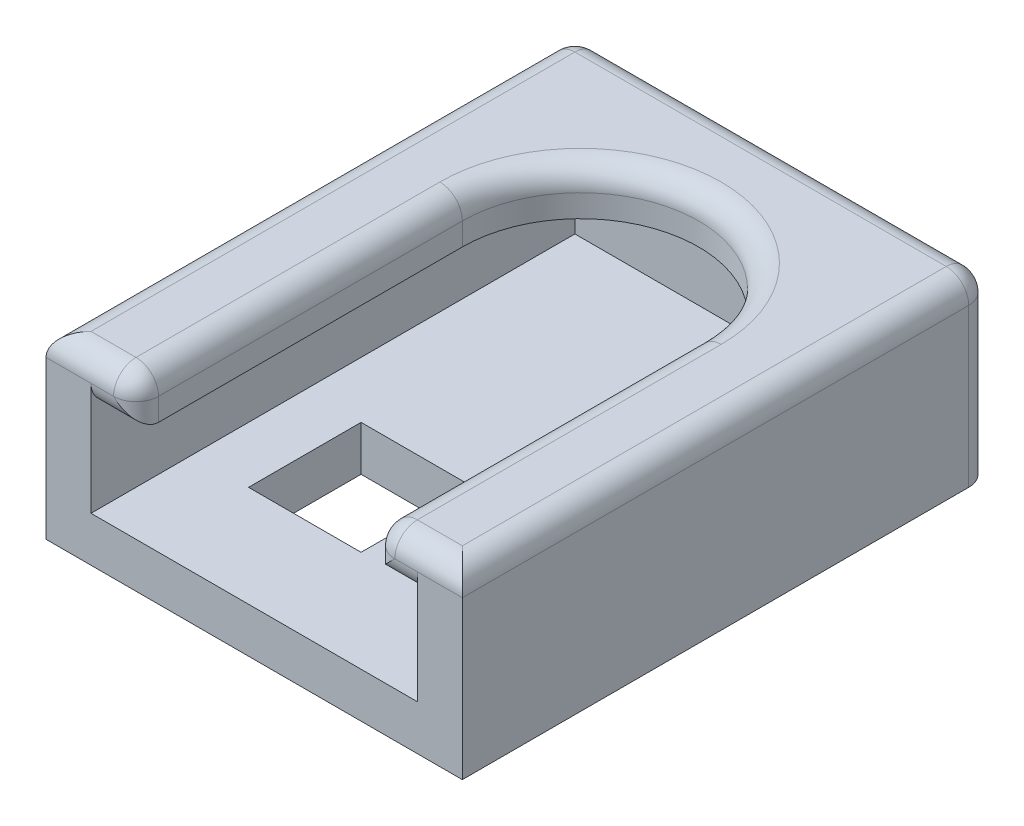
ISO-10303-21;
HEADER;
FILE_DESCRIPTION(('STEP AP214'),'2;1');
FILE_NAME('part.step','',(''),(''),'','','');
FILE_SCHEMA(('AUTOMOTIVE_DESIGN { 1 0 10303 214 1 1 1 1 }'));
ENDSEC;
DATA;
#1=APPLICATION_CONTEXT('core data for automotive mechanical design processes');
#2=APPLICATION_PROTOCOL_DEFINITION('international standard','automotive_design',2000,#1);
#3=PRODUCT_CONTEXT('',#1,'mechanical');
#4=PRODUCT('Part','Part','',(#3));
#5=PRODUCT_RELATED_PRODUCT_CATEGORY('part','',(#4));
#6=PRODUCT_DEFINITION_FORMATION('','',#4);
#7=PRODUCT_DEFINITION_CONTEXT('part definition',#1,'design');
#8=PRODUCT_DEFINITION('design','',#6,#7);
#9=PRODUCT_DEFINITION_SHAPE('','',#8);
#10=(LENGTH_UNIT() NAMED_UNIT(*) SI_UNIT(.MILLI.,.METRE.));
#11=(NAMED_UNIT(*) PLANE_ANGLE_UNIT() SI_UNIT($,.RADIAN.));
#12=(NAMED_UNIT(*) SI_UNIT($,.STERADIAN.) SOLID_ANGLE_UNIT());
#13=UNCERTAINTY_MEASURE_WITH_UNIT(LENGTH_MEASURE(1.E-05),#10,'distance_accuracy_value','');
#14=(GEOMETRIC_REPRESENTATION_CONTEXT(3) GLOBAL_UNCERTAINTY_ASSIGNED_CONTEXT((#13)) GLOBAL_UNIT_ASSIGNED_CONTEXT((#10,
#11,#12)) REPRESENTATION_CONTEXT('',''));
#15=CARTESIAN_POINT('',(0.,0.,0.));
#16=DIRECTION('',(0.,0.,1.));
#17=DIRECTION('',(1.,0.,0.));
#18=AXIS2_PLACEMENT_3D('',#15,#16,#17);
#19=CARTESIAN_POINT('',(7.25,6.,-10.75));
#20=DIRECTION('',(-1.,0.,0.));
#21=DIRECTION('',(0.,0.,1.));
#22=AXIS2_PLACEMENT_3D('',#19,#20,#21);
#23=PLANE('',#22);
#24=DIRECTION('',(0.,-1.,0.));
#25=VECTOR('',#24,1.);
#26=CARTESIAN_POINT('',(7.25,6.,10.75));
#27=LINE('',#26,#25);
#28=CARTESIAN_POINT('',(7.25,5.,10.75));
#29=VERTEX_POINT('',#28);
#30=CARTESIAN_POINT('',(7.25,0.,10.75));
#31=VERTEX_POINT('',#30);
#32=EDGE_CURVE('E333',#29,#31,#27,.T.);
#33=ORIENTED_EDGE('',*,*,#32,.F.);
#34=CARTESIAN_POINT('',(7.25,5.,9.75));
#35=DIRECTION('',(-1.,0.,0.));
#36=DIRECTION('',(0.,0.,1.));
#37=AXIS2_PLACEMENT_3D('',#34,#35,#36);
#38=CIRCLE('',#37,1.);
#39=CARTESIAN_POINT('',(7.25,4.,9.75));
#40=VERTEX_POINT('',#39);
#41=EDGE_CURVE('E11',#29,#40,#38,.F.);
#42=ORIENTED_EDGE('',*,*,#41,.T.);
#43=DIRECTION('',(0.,0.,1.));
#44=VECTOR('',#43,1.);
#45=CARTESIAN_POINT('',(7.25,4.,0.));
#46=LINE('',#45,#44);
#47=CARTESIAN_POINT('',(7.25,4.,-10.75));
#48=VERTEX_POINT('',#47);
#49=EDGE_CURVE('E304',#48,#40,#46,.T.);
#50=ORIENTED_EDGE('',*,*,#49,.F.);
#51=DIRECTION('',(0.,-1.,0.));
#52=VECTOR('',#51,1.);
#53=CARTESIAN_POINT('',(7.25,6.,-10.75));
#54=LINE('',#53,#52);
#55=CARTESIAN_POINT('',(7.25,0.,-10.75));
#56=VERTEX_POINT('',#55);
#57=EDGE_CURVE('E339',#48,#56,#54,.T.);
#58=ORIENTED_EDGE('',*,*,#57,.T.);
#59=DIRECTION('',(0.,0.,-1.));
#60=VECTOR('',#59,1.);
#61=CARTESIAN_POINT('',(7.25,0.,-10.75));
#62=LINE('',#61,#60);
#63=EDGE_CURVE('E319',#31,#56,#62,.T.);
#64=ORIENTED_EDGE('',*,*,#63,.F.);
#65=EDGE_LOOP('',(#33,#42,#50,#58,#64));
#66=FACE_BOUND('',#65,.T.);
#67=ADVANCED_FACE('F39',(#66),#23,.T.);
#68=CARTESIAN_POINT('',(-7.25,6.,-10.75));
#69=DIRECTION('',(0.,0.,1.));
#70=DIRECTION('',(1.,0.,0.));
#71=AXIS2_PLACEMENT_3D('',#68,#69,#70);
#72=PLANE('',#71);
#73=ORIENTED_EDGE('',*,*,#57,.F.);
#74=DIRECTION('',(1.,0.,0.));
#75=VECTOR('',#74,1.);
#76=CARTESIAN_POINT('',(0.,4.,-10.75));
#77=LINE('',#76,#75);
#78=CARTESIAN_POINT('',(-7.25,4.,-10.75));
#79=VERTEX_POINT('',#78);
#80=EDGE_CURVE('E307',#79,#48,#77,.T.);
#81=ORIENTED_EDGE('',*,*,#80,.F.);
#82=DIRECTION('',(0.,-1.,0.));
#83=VECTOR('',#82,1.);
#84=CARTESIAN_POINT('',(-7.25,6.,-10.75));
#85=LINE('',#84,#83);
#86=CARTESIAN_POINT('',(-7.25,0.,-10.75));
#87=VERTEX_POINT('',#86);
#88=EDGE_CURVE('E337',#79,#87,#85,.T.);
#89=ORIENTED_EDGE('',*,*,#88,.T.);
#90=DIRECTION('',(-1.,0.,0.));
#91=VECTOR('',#90,1.);
#92=CARTESIAN_POINT('',(-7.25,0.,-10.75));
#93=LINE('',#92,#91);
#94=EDGE_CURVE('E324',#56,#87,#93,.T.);
#95=ORIENTED_EDGE('',*,*,#94,.F.);
#96=EDGE_LOOP('',(#73,#81,#89,#95));
#97=FACE_BOUND('',#96,.T.);
#98=ADVANCED_FACE('F458',(#97),#72,.T.);
#99=CARTESIAN_POINT('',(-7.25,6.,-10.75));
#100=DIRECTION('',(1.,0.,0.));
#101=DIRECTION('',(0.,0.,-1.));
#102=AXIS2_PLACEMENT_3D('',#99,#100,#101);
#103=PLANE('',#102);
#104=ORIENTED_EDGE('',*,*,#88,.F.);
#105=DIRECTION('',(0.,0.,-1.));
#106=VECTOR('',#105,1.);
#107=CARTESIAN_POINT('',(-7.25,4.,0.));
#108=LINE('',#107,#106);
#109=CARTESIAN_POINT('',(-7.25,4.,9.75));
#110=VERTEX_POINT('',#109);
#111=EDGE_CURVE('E310',#110,#79,#108,.T.);
#112=ORIENTED_EDGE('',*,*,#111,.F.);
#113=CARTESIAN_POINT('',(-7.25,5.,9.75));
#114=DIRECTION('',(1.,0.,0.));
#115=DIRECTION('',(0.,0.,-1.));
#116=AXIS2_PLACEMENT_3D('',#113,#114,#115);
#117=CIRCLE('',#116,1.);
#118=CARTESIAN_POINT('',(-7.25,5.,10.75));
#119=VERTEX_POINT('',#118);
#120=EDGE_CURVE('E49',#110,#119,#117,.F.);
#121=ORIENTED_EDGE('',*,*,#120,.T.);
#122=DIRECTION('',(0.,-1.,0.));
#123=VECTOR('',#122,1.);
#124=CARTESIAN_POINT('',(-7.25,6.,10.75));
#125=LINE('',#124,#123);
#126=CARTESIAN_POINT('',(-7.25,0.,10.75));
#127=VERTEX_POINT('',#126);
#128=EDGE_CURVE('E335',#119,#127,#125,.T.);
#129=ORIENTED_EDGE('',*,*,#128,.T.);
#130=DIRECTION('',(0.,0.,1.));
#131=VECTOR('',#130,1.);
#132=CARTESIAN_POINT('',(-7.25,0.,-10.75));
#133=LINE('',#132,#131);
#134=EDGE_CURVE('E327',#87,#127,#133,.T.);
#135=ORIENTED_EDGE('',*,*,#134,.F.);
#136=EDGE_LOOP('',(#104,#112,#121,#129,#135));
#137=FACE_BOUND('',#136,.T.);
#138=ADVANCED_FACE('F453',(#137),#103,.T.);
#139=CARTESIAN_POINT('',(9.25,6.,-10.75));
#140=DIRECTION('',(-1.,0.,0.));
#141=DIRECTION('',(0.,0.,1.));
#142=AXIS2_PLACEMENT_3D('',#139,#140,#141);
#143=PLANE('',#142);
#144=DIRECTION('',(0.,-1.,0.));
#145=VECTOR('',#144,1.);
#146=CARTESIAN_POINT('',(9.25,6.,-11.75));
#147=LINE('',#146,#145);
#148=CARTESIAN_POINT('',(9.25,-2.,-11.75));
#149=VERTEX_POINT('',#148);
#150=CARTESIAN_POINT('',(9.25,5.,-11.75));
#151=VERTEX_POINT('',#150);
#152=EDGE_CURVE('E392',#149,#151,#147,.F.);
#153=ORIENTED_EDGE('',*,*,#152,.T.);
#154=DIRECTION('',(0.,0.,-1.));
#155=VECTOR('',#154,1.);
#156=CARTESIAN_POINT('',(9.25,5.,10.75));
#157=LINE('',#156,#155);
#158=CARTESIAN_POINT('',(9.25,5.,10.75));
#159=VERTEX_POINT('',#158);
#160=EDGE_CURVE('E394',#151,#159,#157,.F.);
#161=ORIENTED_EDGE('',*,*,#160,.T.);
#162=DIRECTION('',(0.,-1.,0.));
#163=VECTOR('',#162,1.);
#164=CARTESIAN_POINT('',(9.25,6.,10.75));
#165=LINE('',#164,#163);
#166=CARTESIAN_POINT('',(9.25,-2.,10.75));
#167=VERTEX_POINT('',#166);
#168=EDGE_CURVE('E353',#159,#167,#165,.T.);
#169=ORIENTED_EDGE('',*,*,#168,.T.);
#170=DIRECTION('',(0.,0.,-1.));
#171=VECTOR('',#170,1.);
#172=CARTESIAN_POINT('',(9.25,-2.,-10.75));
#173=LINE('',#172,#171);
#174=EDGE_CURVE('E341',#167,#149,#173,.T.);
#175=ORIENTED_EDGE('',*,*,#174,.T.);
#176=EDGE_LOOP('',(#153,#161,#169,#175));
#177=FACE_BOUND('',#176,.T.);
#178=ADVANCED_FACE('F512',(#177),#143,.F.);
#179=CARTESIAN_POINT('',(-7.25,6.,-12.75));
#180=DIRECTION('',(0.,0.,1.));
#181=DIRECTION('',(1.,0.,0.));
#182=AXIS2_PLACEMENT_3D('',#179,#180,#181);
#183=PLANE('',#182);
#184=DIRECTION('',(-1.,0.,0.));
#185=VECTOR('',#184,1.);
#186=CARTESIAN_POINT('',(9.25,5.,-12.75));
#187=LINE('',#186,#185);
#188=CARTESIAN_POINT('',(-8.25,5.,-12.75));
#189=VERTEX_POINT('',#188);
#190=CARTESIAN_POINT('',(8.25,5.,-12.75));
#191=VERTEX_POINT('',#190);
#192=EDGE_CURVE('E214',#189,#191,#187,.F.);
#193=ORIENTED_EDGE('',*,*,#192,.T.);
#194=DIRECTION('',(0.,-1.,0.));
#195=VECTOR('',#194,1.);
#196=CARTESIAN_POINT('',(8.25,6.,-12.75));
#197=LINE('',#196,#195);
#198=CARTESIAN_POINT('',(8.25,-2.,-12.75));
#199=VERTEX_POINT('',#198);
#200=EDGE_CURVE('E218',#191,#199,#197,.T.);
#201=ORIENTED_EDGE('',*,*,#200,.T.);
#202=DIRECTION('',(-1.,0.,0.));
#203=VECTOR('',#202,1.);
#204=CARTESIAN_POINT('',(-7.25,-2.,-12.75));
#205=LINE('',#204,#203);
#206=CARTESIAN_POINT('',(-8.25,-2.,-12.75));
#207=VERTEX_POINT('',#206);
#208=EDGE_CURVE('E344',#199,#207,#205,.T.);
#209=ORIENTED_EDGE('',*,*,#208,.T.);
#210=DIRECTION('',(0.,-1.,0.));
#211=VECTOR('',#210,1.);
#212=CARTESIAN_POINT('',(-8.25,6.,-12.75));
#213=LINE('',#212,#211);
#214=EDGE_CURVE('E221',#207,#189,#213,.F.);
#215=ORIENTED_EDGE('',*,*,#214,.T.);
#216=EDGE_LOOP('',(#193,#201,#209,#215));
#217=FACE_BOUND('',#216,.T.);
#218=ADVANCED_FACE('F216',(#217),#183,.F.);
#219=CARTESIAN_POINT('',(-9.25,6.,-10.75));
#220=DIRECTION('',(1.,0.,0.));
#221=DIRECTION('',(0.,0.,-1.));
#222=AXIS2_PLACEMENT_3D('',#219,#220,#221);
#223=PLANE('',#222);
#224=DIRECTION('',(0.,-1.,0.));
#225=VECTOR('',#224,1.);
#226=CARTESIAN_POINT('',(-9.25,6.,10.75));
#227=LINE('',#226,#225);
#228=CARTESIAN_POINT('',(-9.25,5.,10.75));
#229=VERTEX_POINT('',#228);
#230=CARTESIAN_POINT('',(-9.25,-2.,10.75));
#231=VERTEX_POINT('',#230);
#232=EDGE_CURVE('E349',#229,#231,#227,.T.);
#233=ORIENTED_EDGE('',*,*,#232,.F.);
#234=DIRECTION('',(0.,0.,1.));
#235=VECTOR('',#234,1.);
#236=CARTESIAN_POINT('',(-9.25,5.,-12.75));
#237=LINE('',#236,#235);
#238=CARTESIAN_POINT('',(-9.25,5.,-11.75));
#239=VERTEX_POINT('',#238);
#240=EDGE_CURVE('E58',#229,#239,#237,.F.);
#241=ORIENTED_EDGE('',*,*,#240,.T.);
#242=DIRECTION('',(0.,-1.,0.));
#243=VECTOR('',#242,1.);
#244=CARTESIAN_POINT('',(-9.25,6.,-11.75));
#245=LINE('',#244,#243);
#246=CARTESIAN_POINT('',(-9.25,-2.,-11.75));
#247=VERTEX_POINT('',#246);
#248=EDGE_CURVE('E236',#239,#247,#245,.T.);
#249=ORIENTED_EDGE('',*,*,#248,.T.);
#250=DIRECTION('',(0.,0.,1.));
#251=VECTOR('',#250,1.);
#252=CARTESIAN_POINT('',(-9.25,-2.,-10.75));
#253=LINE('',#252,#251);
#254=EDGE_CURVE('E346',#247,#231,#253,.T.);
#255=ORIENTED_EDGE('',*,*,#254,.T.);
#256=EDGE_LOOP('',(#233,#241,#249,#255));
#257=FACE_BOUND('',#256,.T.);
#258=ADVANCED_FACE('F510',(#257),#223,.F.);
#259=CARTESIAN_POINT('',(-7.25,6.,10.75));
#260=DIRECTION('',(0.,0.,-1.));
#261=DIRECTION('',(-1.,0.,0.));
#262=AXIS2_PLACEMENT_3D('',#259,#260,#261);
#263=PLANE('',#262);
#264=ORIENTED_EDGE('',*,*,#128,.F.);
#265=DIRECTION('',(1.,0.,0.));
#266=VECTOR('',#265,1.);
#267=CARTESIAN_POINT('',(-9.25,5.,10.75));
#268=LINE('',#267,#266);
#269=EDGE_CURVE('E386',#119,#229,#268,.F.);
#270=ORIENTED_EDGE('',*,*,#269,.T.);
#271=ORIENTED_EDGE('',*,*,#232,.T.);
#272=DIRECTION('',(1.,0.,0.));
#273=VECTOR('',#272,1.);
#274=CARTESIAN_POINT('',(-7.25,-2.,10.75));
#275=LINE('',#274,#273);
#276=EDGE_CURVE('E348',#231,#167,#275,.T.);
#277=ORIENTED_EDGE('',*,*,#276,.T.);
#278=ORIENTED_EDGE('',*,*,#168,.F.);
#279=DIRECTION('',(1.,0.,0.));
#280=VECTOR('',#279,1.);
#281=CARTESIAN_POINT('',(5.25,5.,10.75));
#282=LINE('',#281,#280);
#283=EDGE_CURVE('E383',#159,#29,#282,.F.);
#284=ORIENTED_EDGE('',*,*,#283,.T.);
#285=ORIENTED_EDGE('',*,*,#32,.T.);
#286=DIRECTION('',(1.,0.,0.));
#287=VECTOR('',#286,1.);
#288=CARTESIAN_POINT('',(-7.25,0.,10.75));
#289=LINE('',#288,#287);
#290=EDGE_CURVE('E330',#127,#31,#289,.T.);
#291=ORIENTED_EDGE('',*,*,#290,.F.);
#292=EDGE_LOOP('',(#264,#270,#271,#277,#278,#284,#285,#291));
#293=FACE_BOUND('',#292,.T.);
#294=ADVANCED_FACE('F507',(#293),#263,.F.);
#295=CARTESIAN_POINT('',(0.,6.,0.));
#296=DIRECTION('',(0.,1.,0.));
#297=DIRECTION('',(0.,0.,1.));
#298=AXIS2_PLACEMENT_3D('',#295,#296,#297);
#299=PLANE('',#298);
#300=CARTESIAN_POINT('',(0.,6.,-3.75));
#301=DIRECTION('',(0.,1.,0.));
#302=DIRECTION('',(0.,0.,1.));
#303=AXIS2_PLACEMENT_3D('',#300,#301,#302);
#304=CIRCLE('',#303,6.25);
#305=CARTESIAN_POINT('',(-6.25,6.,-3.75));
#306=VERTEX_POINT('',#305);
#307=CARTESIAN_POINT('',(6.25,6.,-3.75));
#308=VERTEX_POINT('',#307);
#309=EDGE_CURVE('E367',#306,#308,#304,.F.);
#310=ORIENTED_EDGE('',*,*,#309,.T.);
#311=DIRECTION('',(0.,0.,1.));
#312=VECTOR('',#311,1.);
#313=CARTESIAN_POINT('',(6.25,6.,0.));
#314=LINE('',#313,#312);
#315=CARTESIAN_POINT('',(6.25,6.,9.75));
#316=VERTEX_POINT('',#315);
#317=EDGE_CURVE('E369',#308,#316,#314,.T.);
#318=ORIENTED_EDGE('',*,*,#317,.T.);
#319=DIRECTION('',(1.,0.,0.));
#320=VECTOR('',#319,1.);
#321=CARTESIAN_POINT('',(9.25,6.,9.75));
#322=LINE('',#321,#320);
#323=CARTESIAN_POINT('',(8.25,6.,9.75));
#324=VERTEX_POINT('',#323);
#325=EDGE_CURVE('E361',#316,#324,#322,.T.);
#326=ORIENTED_EDGE('',*,*,#325,.T.);
#327=DIRECTION('',(0.,0.,-1.));
#328=VECTOR('',#327,1.);
#329=CARTESIAN_POINT('',(8.25,6.,-12.75));
#330=LINE('',#329,#328);
#331=CARTESIAN_POINT('',(8.25,6.,-11.75));
#332=VERTEX_POINT('',#331);
#333=EDGE_CURVE('E359',#324,#332,#330,.T.);
#334=ORIENTED_EDGE('',*,*,#333,.T.);
#335=DIRECTION('',(-1.,0.,0.));
#336=VECTOR('',#335,1.);
#337=CARTESIAN_POINT('',(-9.25,6.,-11.75));
#338=LINE('',#337,#336);
#339=CARTESIAN_POINT('',(-8.25,6.,-11.75));
#340=VERTEX_POINT('',#339);
#341=EDGE_CURVE('E242',#332,#340,#338,.T.);
#342=ORIENTED_EDGE('',*,*,#341,.T.);
#343=DIRECTION('',(0.,0.,1.));
#344=VECTOR('',#343,1.);
#345=CARTESIAN_POINT('',(-8.25,6.,10.75));
#346=LINE('',#345,#344);
#347=CARTESIAN_POINT('',(-8.25,6.,9.75));
#348=VERTEX_POINT('',#347);
#349=EDGE_CURVE('E352',#340,#348,#346,.T.);
#350=ORIENTED_EDGE('',*,*,#349,.T.);
#351=DIRECTION('',(1.,0.,0.));
#352=VECTOR('',#351,1.);
#353=CARTESIAN_POINT('',(-5.25,6.,9.75));
#354=LINE('',#353,#352);
#355=CARTESIAN_POINT('',(-6.25,6.,9.75));
#356=VERTEX_POINT('',#355);
#357=EDGE_CURVE('E363',#348,#356,#354,.T.);
#358=ORIENTED_EDGE('',*,*,#357,.T.);
#359=DIRECTION('',(0.,0.,1.));
#360=VECTOR('',#359,1.);
#361=CARTESIAN_POINT('',(-6.25,6.,-3.75));
#362=LINE('',#361,#360);
#363=EDGE_CURVE('E365',#356,#306,#362,.F.);
#364=ORIENTED_EDGE('',*,*,#363,.T.);
#365=EDGE_LOOP('',(#310,#318,#326,#334,#342,#350,#358,#364));
#366=FACE_BOUND('',#365,.T.);
#367=ADVANCED_FACE('F484',(#366),#299,.T.);
#368=CARTESIAN_POINT('',(0.,-2.,0.));
#369=DIRECTION('',(0.,1.,0.));
#370=DIRECTION('',(0.,0.,1.));
#371=AXIS2_PLACEMENT_3D('',#368,#369,#370);
#372=PLANE('',#371);
#373=DIRECTION('',(1.,0.,0.));
#374=VECTOR('',#373,1.);
#375=CARTESIAN_POINT('',(-4.75,-2.,1.25));
#376=LINE('',#375,#374);
#377=CARTESIAN_POINT('',(-4.75,-2.,1.25));
#378=VERTEX_POINT('',#377);
#379=CARTESIAN_POINT('',(0.249999999999998,-2.,1.25));
#380=VERTEX_POINT('',#379);
#381=EDGE_CURVE('E894',#378,#380,#376,.T.);
#382=ORIENTED_EDGE('',*,*,#381,.F.);
#383=DIRECTION('',(0.,0.,-1.));
#384=VECTOR('',#383,1.);
#385=CARTESIAN_POINT('',(-4.75,-2.,1.25));
#386=LINE('',#385,#384);
#387=CARTESIAN_POINT('',(-4.75,-2.,6.25));
#388=VERTEX_POINT('',#387);
#389=EDGE_CURVE('E281',#388,#378,#386,.T.);
#390=ORIENTED_EDGE('',*,*,#389,.F.);
#391=DIRECTION('',(-1.,0.,0.));
#392=VECTOR('',#391,1.);
#393=CARTESIAN_POINT('',(-4.75,-2.,6.25));
#394=LINE('',#393,#392);
#395=CARTESIAN_POINT('',(0.249999999999999,-2.,6.25));
#396=VERTEX_POINT('',#395);
#397=EDGE_CURVE('E296',#396,#388,#394,.T.);
#398=ORIENTED_EDGE('',*,*,#397,.F.);
#399=DIRECTION('',(0.,0.,1.));
#400=VECTOR('',#399,1.);
#401=CARTESIAN_POINT('',(0.249999999999998,-2.,1.25));
#402=LINE('',#401,#400);
#403=EDGE_CURVE('E291',#380,#396,#402,.T.);
#404=ORIENTED_EDGE('',*,*,#403,.F.);
#405=EDGE_LOOP('',(#382,#390,#398,#404));
#406=FACE_BOUND('',#405,.T.);
#407=ORIENTED_EDGE('',*,*,#208,.F.);
#408=CARTESIAN_POINT('',(8.25,-2.,-11.75));
#409=DIRECTION('',(0.,1.,0.));
#410=DIRECTION('',(0.,0.,1.));
#411=AXIS2_PLACEMENT_3D('',#408,#409,#410);
#412=CIRCLE('',#411,1.);
#413=EDGE_CURVE('E235',#199,#149,#412,.F.);
#414=ORIENTED_EDGE('',*,*,#413,.T.);
#415=ORIENTED_EDGE('',*,*,#174,.F.);
#416=ORIENTED_EDGE('',*,*,#276,.F.);
#417=ORIENTED_EDGE('',*,*,#254,.F.);
#418=CARTESIAN_POINT('',(-8.25,-2.,-11.75));
#419=DIRECTION('',(0.,1.,0.));
#420=DIRECTION('',(0.,0.,1.));
#421=AXIS2_PLACEMENT_3D('',#418,#419,#420);
#422=CIRCLE('',#421,1.);
#423=EDGE_CURVE('E399',#247,#207,#422,.F.);
#424=ORIENTED_EDGE('',*,*,#423,.T.);
#425=EDGE_LOOP('',(#407,#414,#415,#416,#417,#424));
#426=FACE_BOUND('',#425,.T.);
#427=ADVANCED_FACE('F506',(#406,#426),#372,.F.);
#428=CARTESIAN_POINT('',(0.,0.,0.));
#429=DIRECTION('',(0.,1.,0.));
#430=DIRECTION('',(0.,0.,1.));
#431=AXIS2_PLACEMENT_3D('',#428,#429,#430);
#432=PLANE('',#431);
#433=DIRECTION('',(0.,0.,1.));
#434=VECTOR('',#433,1.);
#435=CARTESIAN_POINT('',(-4.75,0.,1.25));
#436=LINE('',#435,#434);
#437=CARTESIAN_POINT('',(-4.75,0.,1.25));
#438=VERTEX_POINT('',#437);
#439=CARTESIAN_POINT('',(-4.75,0.,6.25));
#440=VERTEX_POINT('',#439);
#441=EDGE_CURVE('E269',#438,#440,#436,.T.);
#442=ORIENTED_EDGE('',*,*,#441,.F.);
#443=DIRECTION('',(-1.,0.,0.));
#444=VECTOR('',#443,1.);
#445=CARTESIAN_POINT('',(-4.75,0.,1.25));
#446=LINE('',#445,#444);
#447=CARTESIAN_POINT('',(0.249999999999998,0.,1.25));
#448=VERTEX_POINT('',#447);
#449=EDGE_CURVE('E285',#448,#438,#446,.T.);
#450=ORIENTED_EDGE('',*,*,#449,.F.);
#451=DIRECTION('',(0.,0.,-1.));
#452=VECTOR('',#451,1.);
#453=CARTESIAN_POINT('',(0.249999999999998,0.,1.25));
#454=LINE('',#453,#452);
#455=CARTESIAN_POINT('',(0.249999999999999,0.,6.25));
#456=VERTEX_POINT('',#455);
#457=EDGE_CURVE('E278',#456,#448,#454,.T.);
#458=ORIENTED_EDGE('',*,*,#457,.F.);
#459=DIRECTION('',(1.,0.,0.));
#460=VECTOR('',#459,1.);
#461=CARTESIAN_POINT('',(-4.75,0.,6.25));
#462=LINE('',#461,#460);
#463=EDGE_CURVE('E272',#440,#456,#462,.T.);
#464=ORIENTED_EDGE('',*,*,#463,.F.);
#465=EDGE_LOOP('',(#442,#450,#458,#464));
#466=FACE_BOUND('',#465,.T.);
#467=ORIENTED_EDGE('',*,*,#63,.T.);
#468=ORIENTED_EDGE('',*,*,#94,.T.);
#469=ORIENTED_EDGE('',*,*,#134,.T.);
#470=ORIENTED_EDGE('',*,*,#290,.T.);
#471=EDGE_LOOP('',(#467,#468,#469,#470));
#472=FACE_BOUND('',#471,.T.);
#473=ADVANCED_FACE('F522',(#466,#472),#432,.T.);
#474=CARTESIAN_POINT('',(0.,4.,-3.75));
#475=DIRECTION('',(0.,1.,0.));
#476=DIRECTION('',(0.,0.,1.));
#477=AXIS2_PLACEMENT_3D('',#474,#475,#476);
#478=CYLINDRICAL_SURFACE('',#477,5.25);
#479=DIRECTION('',(0.,1.,0.));
#480=VECTOR('',#479,1.);
#481=CARTESIAN_POINT('',(5.25,4.,-3.75));
#482=LINE('',#481,#480);
#483=CARTESIAN_POINT('',(5.25,4.,-3.75));
#484=VERTEX_POINT('',#483);
#485=CARTESIAN_POINT('',(5.25,5.,-3.75));
#486=VERTEX_POINT('',#485);
#487=EDGE_CURVE('E315',#484,#486,#482,.T.);
#488=ORIENTED_EDGE('',*,*,#487,.T.);
#489=CARTESIAN_POINT('',(0.,5.,-3.75));
#490=DIRECTION('',(0.,1.,0.));
#491=DIRECTION('',(0.,0.,1.));
#492=AXIS2_PLACEMENT_3D('',#489,#490,#491);
#493=CIRCLE('',#492,5.25);
#494=CARTESIAN_POINT('',(-5.25,5.,-3.75));
#495=VERTEX_POINT('',#494);
#496=EDGE_CURVE('E377',#486,#495,#493,.T.);
#497=ORIENTED_EDGE('',*,*,#496,.T.);
#498=DIRECTION('',(0.,1.,0.));
#499=VECTOR('',#498,1.);
#500=CARTESIAN_POINT('',(-5.25,4.,-3.75));
#501=LINE('',#500,#499);
#502=CARTESIAN_POINT('',(-5.25,4.,-3.75));
#503=VERTEX_POINT('',#502);
#504=EDGE_CURVE('E316',#503,#495,#501,.T.);
#505=ORIENTED_EDGE('',*,*,#504,.F.);
#506=CARTESIAN_POINT('',(0.,4.,-3.75));
#507=DIRECTION('',(0.,1.,0.));
#508=DIRECTION('',(0.,0.,1.));
#509=AXIS2_PLACEMENT_3D('',#506,#507,#508);
#510=CIRCLE('',#509,5.25);
#511=EDGE_CURVE('E298',#484,#503,#510,.T.);
#512=ORIENTED_EDGE('',*,*,#511,.F.);
#513=EDGE_LOOP('',(#488,#497,#505,#512));
#514=FACE_BOUND('',#513,.T.);
#515=ADVANCED_FACE('F473',(#514),#478,.F.);
#516=CARTESIAN_POINT('',(-5.25,4.,0.));
#517=DIRECTION('',(-1.,0.,0.));
#518=DIRECTION('',(0.,0.,1.));
#519=AXIS2_PLACEMENT_3D('',#516,#517,#518);
#520=PLANE('',#519);
#521=DIRECTION('',(0.,0.,1.));
#522=VECTOR('',#521,1.);
#523=CARTESIAN_POINT('',(-5.25,5.,10.75));
#524=LINE('',#523,#522);
#525=CARTESIAN_POINT('',(-5.25,5.,9.75));
#526=VERTEX_POINT('',#525);
#527=EDGE_CURVE('E388',#495,#526,#524,.T.);
#528=ORIENTED_EDGE('',*,*,#527,.T.);
#529=DIRECTION('',(0.,1.,0.));
#530=VECTOR('',#529,1.);
#531=CARTESIAN_POINT('',(-5.25,4.,9.75));
#532=LINE('',#531,#530);
#533=CARTESIAN_POINT('',(-5.25,4.,9.75));
#534=VERTEX_POINT('',#533);
#535=EDGE_CURVE('E390',#526,#534,#532,.F.);
#536=ORIENTED_EDGE('',*,*,#535,.T.);
#537=DIRECTION('',(0.,0.,1.));
#538=VECTOR('',#537,1.);
#539=CARTESIAN_POINT('',(-5.25,4.,0.));
#540=LINE('',#539,#538);
#541=EDGE_CURVE('E312',#503,#534,#540,.T.);
#542=ORIENTED_EDGE('',*,*,#541,.F.);
#543=ORIENTED_EDGE('',*,*,#504,.T.);
#544=EDGE_LOOP('',(#528,#536,#542,#543));
#545=FACE_BOUND('',#544,.T.);
#546=ADVANCED_FACE('F442',(#545),#520,.F.);
#547=CARTESIAN_POINT('',(5.25,4.,0.));
#548=DIRECTION('',(-1.,0.,0.));
#549=DIRECTION('',(0.,0.,1.));
#550=AXIS2_PLACEMENT_3D('',#547,#548,#549);
#551=PLANE('',#550);
#552=DIRECTION('',(0.,1.,0.));
#553=VECTOR('',#552,1.);
#554=CARTESIAN_POINT('',(5.25,6.,9.75));
#555=LINE('',#554,#553);
#556=CARTESIAN_POINT('',(5.25,4.,9.75));
#557=VERTEX_POINT('',#556);
#558=CARTESIAN_POINT('',(5.25,5.,9.75));
#559=VERTEX_POINT('',#558);
#560=EDGE_CURVE('E372',#557,#559,#555,.T.);
#561=ORIENTED_EDGE('',*,*,#560,.T.);
#562=DIRECTION('',(0.,0.,1.));
#563=VECTOR('',#562,1.);
#564=CARTESIAN_POINT('',(5.25,5.,0.));
#565=LINE('',#564,#563);
#566=EDGE_CURVE('E374',#559,#486,#565,.F.);
#567=ORIENTED_EDGE('',*,*,#566,.T.);
#568=ORIENTED_EDGE('',*,*,#487,.F.);
#569=DIRECTION('',(0.,0.,1.));
#570=VECTOR('',#569,1.);
#571=CARTESIAN_POINT('',(5.25,4.,0.));
#572=LINE('',#571,#570);
#573=EDGE_CURVE('E301',#484,#557,#572,.T.);
#574=ORIENTED_EDGE('',*,*,#573,.T.);
#575=EDGE_LOOP('',(#561,#567,#568,#574));
#576=FACE_BOUND('',#575,.T.);
#577=ADVANCED_FACE('F471',(#576),#551,.T.);
#578=CARTESIAN_POINT('',(0.,4.,0.));
#579=DIRECTION('',(0.,1.,0.));
#580=DIRECTION('',(0.,0.,1.));
#581=AXIS2_PLACEMENT_3D('',#578,#579,#580);
#582=PLANE('',#581);
#583=ORIENTED_EDGE('',*,*,#541,.T.);
#584=DIRECTION('',(1.,0.,0.));
#585=VECTOR('',#584,1.);
#586=CARTESIAN_POINT('',(0.,4.,9.75));
#587=LINE('',#586,#585);
#588=EDGE_CURVE('E381',#534,#110,#587,.F.);
#589=ORIENTED_EDGE('',*,*,#588,.T.);
#590=ORIENTED_EDGE('',*,*,#111,.T.);
#591=ORIENTED_EDGE('',*,*,#80,.T.);
#592=ORIENTED_EDGE('',*,*,#49,.T.);
#593=DIRECTION('',(-1.,0.,0.));
#594=VECTOR('',#593,1.);
#595=CARTESIAN_POINT('',(0.,4.,9.75));
#596=LINE('',#595,#594);
#597=EDGE_CURVE('E379',#40,#557,#596,.T.);
#598=ORIENTED_EDGE('',*,*,#597,.T.);
#599=ORIENTED_EDGE('',*,*,#573,.F.);
#600=ORIENTED_EDGE('',*,*,#511,.T.);
#601=EDGE_LOOP('',(#583,#589,#590,#591,#592,#598,#599,#600));
#602=FACE_BOUND('',#601,.T.);
#603=ADVANCED_FACE('F445',(#602),#582,.F.);
#604=CARTESIAN_POINT('',(-4.75,-9.07106781186548,1.25));
#605=DIRECTION('',(-1.,0.,0.));
#606=DIRECTION('',(0.,0.,1.));
#607=AXIS2_PLACEMENT_3D('',#604,#605,#606);
#608=PLANE('',#607);
#609=ORIENTED_EDGE('',*,*,#389,.T.);
#610=DIRECTION('',(0.,1.,0.));
#611=VECTOR('',#610,1.);
#612=CARTESIAN_POINT('',(-4.75,-9.07106781186548,1.25));
#613=LINE('',#612,#611);
#614=EDGE_CURVE('E289',#378,#438,#613,.T.);
#615=ORIENTED_EDGE('',*,*,#614,.T.);
#616=ORIENTED_EDGE('',*,*,#441,.T.);
#617=DIRECTION('',(0.,1.,0.));
#618=VECTOR('',#617,1.);
#619=CARTESIAN_POINT('',(-4.75,-9.07106781186548,6.25));
#620=LINE('',#619,#618);
#621=EDGE_CURVE('E288',#388,#440,#620,.T.);
#622=ORIENTED_EDGE('',*,*,#621,.F.);
#623=EDGE_LOOP('',(#609,#615,#616,#622));
#624=FACE_BOUND('',#623,.T.);
#625=ADVANCED_FACE('F729',(#624),#608,.F.);
#626=CARTESIAN_POINT('',(-4.75,-9.07106781186548,1.25));
#627=DIRECTION('',(0.,0.,-1.));
#628=DIRECTION('',(-1.,0.,0.));
#629=AXIS2_PLACEMENT_3D('',#626,#627,#628);
#630=PLANE('',#629);
#631=ORIENTED_EDGE('',*,*,#381,.T.);
#632=DIRECTION('',(0.,1.,0.));
#633=VECTOR('',#632,1.);
#634=CARTESIAN_POINT('',(0.249999999999998,-9.07106781186548,1.25));
#635=LINE('',#634,#633);
#636=EDGE_CURVE('E292',#380,#448,#635,.T.);
#637=ORIENTED_EDGE('',*,*,#636,.T.);
#638=ORIENTED_EDGE('',*,*,#449,.T.);
#639=ORIENTED_EDGE('',*,*,#614,.F.);
#640=EDGE_LOOP('',(#631,#637,#638,#639));
#641=FACE_BOUND('',#640,.T.);
#642=ADVANCED_FACE('F719',(#641),#630,.F.);
#643=CARTESIAN_POINT('',(0.249999999999998,-9.07106781186548,1.25));
#644=DIRECTION('',(1.,0.,0.));
#645=DIRECTION('',(0.,0.,-1.));
#646=AXIS2_PLACEMENT_3D('',#643,#644,#645);
#647=PLANE('',#646);
#648=ORIENTED_EDGE('',*,*,#403,.T.);
#649=DIRECTION('',(0.,1.,0.));
#650=VECTOR('',#649,1.);
#651=CARTESIAN_POINT('',(0.249999999999999,-9.07106781186548,6.25));
#652=LINE('',#651,#650);
#653=EDGE_CURVE('E86',#396,#456,#652,.T.);
#654=ORIENTED_EDGE('',*,*,#653,.T.);
#655=ORIENTED_EDGE('',*,*,#457,.T.);
#656=ORIENTED_EDGE('',*,*,#636,.F.);
#657=EDGE_LOOP('',(#648,#654,#655,#656));
#658=FACE_BOUND('',#657,.T.);
#659=ADVANCED_FACE('F708',(#658),#647,.F.);
#660=CARTESIAN_POINT('',(-4.75,-9.07106781186548,6.25));
#661=DIRECTION('',(0.,0.,1.));
#662=DIRECTION('',(1.,0.,0.));
#663=AXIS2_PLACEMENT_3D('',#660,#661,#662);
#664=PLANE('',#663);
#665=ORIENTED_EDGE('',*,*,#397,.T.);
#666=ORIENTED_EDGE('',*,*,#621,.T.);
#667=ORIENTED_EDGE('',*,*,#463,.T.);
#668=ORIENTED_EDGE('',*,*,#653,.F.);
#669=EDGE_LOOP('',(#665,#666,#667,#668));
#670=FACE_BOUND('',#669,.T.);
#671=ADVANCED_FACE('F697',(#670),#664,.F.);
#672=CARTESIAN_POINT('',(-8.25,6.,-11.75));
#673=DIRECTION('',(0.,-1.,0.));
#674=DIRECTION('',(0.,0.,-1.));
#675=AXIS2_PLACEMENT_3D('',#672,#673,#674);
#676=CYLINDRICAL_SURFACE('',#675,1.);
#677=CARTESIAN_POINT('',(-8.25,5.,-11.75));
#678=DIRECTION('',(0.,1.,0.));
#679=DIRECTION('',(0.,0.,1.));
#680=AXIS2_PLACEMENT_3D('',#677,#678,#679);
#681=CIRCLE('',#680,1.);
#682=EDGE_CURVE('E43',#189,#239,#681,.T.);
#683=ORIENTED_EDGE('',*,*,#682,.F.);
#684=ORIENTED_EDGE('',*,*,#214,.F.);
#685=ORIENTED_EDGE('',*,*,#423,.F.);
#686=ORIENTED_EDGE('',*,*,#248,.F.);
#687=EDGE_LOOP('',(#683,#684,#685,#686));
#688=FACE_BOUND('',#687,.T.);
#689=ADVANCED_FACE('F41',(#688),#676,.T.);
#690=CARTESIAN_POINT('',(-8.25,5.,-11.75));
#691=DIRECTION('',(-1.,0.,0.));
#692=DIRECTION('',(0.,0.,1.));
#693=AXIS2_PLACEMENT_3D('',#690,#691,#692);
#694=SPHERICAL_SURFACE('',#693,1.);
#695=CARTESIAN_POINT('',(-8.25,5.,-11.75));
#696=DIRECTION('',(-1.,0.,0.));
#697=DIRECTION('',(0.,0.,1.));
#698=AXIS2_PLACEMENT_3D('',#695,#696,#697);
#699=CIRCLE('',#698,1.);
#700=EDGE_CURVE('E262',#189,#340,#699,.F.);
#701=ORIENTED_EDGE('',*,*,#700,.F.);
#702=ORIENTED_EDGE('',*,*,#682,.T.);
#703=CARTESIAN_POINT('',(-8.25,5.,-11.75));
#704=DIRECTION('',(0.,0.,-1.));
#705=DIRECTION('',(-1.,0.,0.));
#706=AXIS2_PLACEMENT_3D('',#703,#704,#705);
#707=CIRCLE('',#706,1.);
#708=EDGE_CURVE('E263',#340,#239,#707,.F.);
#709=ORIENTED_EDGE('',*,*,#708,.F.);
#710=EDGE_LOOP('',(#701,#702,#709));
#711=FACE_BOUND('',#710,.T.);
#712=ADVANCED_FACE('F494',(#711),#694,.T.);
#713=CARTESIAN_POINT('',(-7.25,5.,9.75));
#714=DIRECTION('',(1.,0.,0.));
#715=DIRECTION('',(0.,0.,-1.));
#716=AXIS2_PLACEMENT_3D('',#713,#714,#715);
#717=CYLINDRICAL_SURFACE('',#716,1.);
#718=ORIENTED_EDGE('',*,*,#120,.F.);
#719=ORIENTED_EDGE('',*,*,#588,.F.);
#720=CARTESIAN_POINT('',(-6.25,5.,9.75));
#721=DIRECTION('',(0.707106781186547,0.707106781186547,0.));
#722=DIRECTION('',(-0.707106781186547,0.707106781186547,0.));
#723=AXIS2_PLACEMENT_3D('',#720,#721,#722);
#724=ELLIPSE('',#723,1.41421356237309,1.);
#725=CARTESIAN_POINT('',(-6.25,5.,10.75));
#726=VERTEX_POINT('',#725);
#727=EDGE_CURVE('E77',#726,#534,#724,.T.);
#728=ORIENTED_EDGE('',*,*,#727,.F.);
#729=DIRECTION('',(1.,0.,0.));
#730=VECTOR('',#729,1.);
#731=CARTESIAN_POINT('',(-7.25,5.,10.75));
#732=LINE('',#731,#730);
#733=EDGE_CURVE('E259',#119,#726,#732,.T.);
#734=ORIENTED_EDGE('',*,*,#733,.F.);
#735=EDGE_LOOP('',(#718,#719,#728,#734));
#736=FACE_BOUND('',#735,.T.);
#737=ADVANCED_FACE('F450',(#736),#717,.T.);
#738=CARTESIAN_POINT('',(-8.25,5.,0.));
#739=DIRECTION('',(0.,0.,-1.));
#740=DIRECTION('',(-1.,0.,0.));
#741=AXIS2_PLACEMENT_3D('',#738,#739,#740);
#742=CYLINDRICAL_SURFACE('',#741,1.);
#743=ORIENTED_EDGE('',*,*,#708,.T.);
#744=ORIENTED_EDGE('',*,*,#240,.F.);
#745=CARTESIAN_POINT('',(-8.25,5.,9.75));
#746=DIRECTION('',(-0.707106781186548,0.,-0.707106781186547));
#747=DIRECTION('',(0.707106781186547,0.,-0.707106781186548));
#748=AXIS2_PLACEMENT_3D('',#745,#746,#747);
#749=ELLIPSE('',#748,1.41421356237309,1.);
#750=EDGE_CURVE('E245',#348,#229,#749,.F.);
#751=ORIENTED_EDGE('',*,*,#750,.F.);
#752=ORIENTED_EDGE('',*,*,#349,.F.);
#753=EDGE_LOOP('',(#743,#744,#751,#752));
#754=FACE_BOUND('',#753,.T.);
#755=ADVANCED_FACE('F486',(#754),#742,.T.);
#756=CARTESIAN_POINT('',(0.,5.,-11.75));
#757=DIRECTION('',(1.,0.,0.));
#758=DIRECTION('',(0.,0.,-1.));
#759=AXIS2_PLACEMENT_3D('',#756,#757,#758);
#760=CYLINDRICAL_SURFACE('',#759,1.);
#761=ORIENTED_EDGE('',*,*,#700,.T.);
#762=ORIENTED_EDGE('',*,*,#341,.F.);
#763=CARTESIAN_POINT('',(8.25,5.,-11.75));
#764=DIRECTION('',(1.,0.,0.));
#765=DIRECTION('',(0.,0.,-1.));
#766=AXIS2_PLACEMENT_3D('',#763,#764,#765);
#767=CIRCLE('',#766,1.);
#768=EDGE_CURVE('E240',#191,#332,#767,.T.);
#769=ORIENTED_EDGE('',*,*,#768,.F.);
#770=ORIENTED_EDGE('',*,*,#192,.F.);
#771=EDGE_LOOP('',(#761,#762,#769,#770));
#772=FACE_BOUND('',#771,.T.);
#773=ADVANCED_FACE('F241',(#772),#760,.T.);
#774=CARTESIAN_POINT('',(8.25,6.,-11.75));
#775=DIRECTION('',(0.,-1.,0.));
#776=DIRECTION('',(0.,0.,-1.));
#777=AXIS2_PLACEMENT_3D('',#774,#775,#776);
#778=CYLINDRICAL_SURFACE('',#777,1.);
#779=ORIENTED_EDGE('',*,*,#413,.F.);
#780=ORIENTED_EDGE('',*,*,#200,.F.);
#781=CARTESIAN_POINT('',(8.25,5.,-11.75));
#782=DIRECTION('',(0.,1.,0.));
#783=DIRECTION('',(0.,0.,1.));
#784=AXIS2_PLACEMENT_3D('',#781,#782,#783);
#785=CIRCLE('',#784,1.);
#786=EDGE_CURVE('E233',#151,#191,#785,.T.);
#787=ORIENTED_EDGE('',*,*,#786,.F.);
#788=ORIENTED_EDGE('',*,*,#152,.F.);
#789=EDGE_LOOP('',(#779,#780,#787,#788));
#790=FACE_BOUND('',#789,.T.);
#791=ADVANCED_FACE('F230',(#790),#778,.T.);
#792=CARTESIAN_POINT('',(-6.25,6.,9.75));
#793=DIRECTION('',(0.,1.,0.));
#794=DIRECTION('',(0.,0.,1.));
#795=AXIS2_PLACEMENT_3D('',#792,#793,#794);
#796=CYLINDRICAL_SURFACE('',#795,1.);
#797=ORIENTED_EDGE('',*,*,#727,.T.);
#798=ORIENTED_EDGE('',*,*,#535,.F.);
#799=CARTESIAN_POINT('',(-6.25,5.,9.75));
#800=DIRECTION('',(0.,1.,0.));
#801=DIRECTION('',(0.,0.,1.));
#802=AXIS2_PLACEMENT_3D('',#799,#800,#801);
#803=CIRCLE('',#802,1.);
#804=EDGE_CURVE('E250',#726,#526,#803,.T.);
#805=ORIENTED_EDGE('',*,*,#804,.F.);
#806=EDGE_LOOP('',(#797,#798,#805));
#807=FACE_BOUND('',#806,.T.);
#808=ADVANCED_FACE('F440',(#807),#796,.T.);
#809=CARTESIAN_POINT('',(0.,5.,9.75));
#810=DIRECTION('',(-1.,0.,0.));
#811=DIRECTION('',(0.,0.,1.));
#812=AXIS2_PLACEMENT_3D('',#809,#810,#811);
#813=CYLINDRICAL_SURFACE('',#812,1.);
#814=ORIENTED_EDGE('',*,*,#269,.F.);
#815=ORIENTED_EDGE('',*,*,#733,.T.);
#816=CARTESIAN_POINT('',(-6.25,5.,9.75));
#817=DIRECTION('',(1.,0.,0.));
#818=DIRECTION('',(0.,0.,-1.));
#819=AXIS2_PLACEMENT_3D('',#816,#817,#818);
#820=CIRCLE('',#819,1.);
#821=EDGE_CURVE('E253',#356,#726,#820,.T.);
#822=ORIENTED_EDGE('',*,*,#821,.F.);
#823=ORIENTED_EDGE('',*,*,#357,.F.);
#824=ORIENTED_EDGE('',*,*,#750,.T.);
#825=EDGE_LOOP('',(#814,#815,#822,#823,#824));
#826=FACE_BOUND('',#825,.T.);
#827=ADVANCED_FACE('F436',(#826),#813,.T.);
#828=CARTESIAN_POINT('',(8.25,5.,-11.75));
#829=DIRECTION('',(0.,0.,-1.));
#830=DIRECTION('',(-1.,0.,0.));
#831=AXIS2_PLACEMENT_3D('',#828,#829,#830);
#832=SPHERICAL_SURFACE('',#831,1.);
#833=ORIENTED_EDGE('',*,*,#786,.T.);
#834=ORIENTED_EDGE('',*,*,#768,.T.);
#835=CARTESIAN_POINT('',(8.25,5.,-11.75));
#836=DIRECTION('',(0.,0.,-1.));
#837=DIRECTION('',(-1.,0.,0.));
#838=AXIS2_PLACEMENT_3D('',#835,#836,#837);
#839=CIRCLE('',#838,1.);
#840=EDGE_CURVE('E248',#151,#332,#839,.F.);
#841=ORIENTED_EDGE('',*,*,#840,.F.);
#842=EDGE_LOOP('',(#833,#834,#841));
#843=FACE_BOUND('',#842,.T.);
#844=ADVANCED_FACE('F247',(#843),#832,.T.);
#845=CARTESIAN_POINT('',(-6.25,5.,9.75));
#846=DIRECTION('',(0.,0.,1.));
#847=DIRECTION('',(1.,0.,0.));
#848=AXIS2_PLACEMENT_3D('',#845,#846,#847);
#849=SPHERICAL_SURFACE('',#848,1.);
#850=ORIENTED_EDGE('',*,*,#821,.T.);
#851=ORIENTED_EDGE('',*,*,#804,.T.);
#852=CARTESIAN_POINT('',(-6.25,5.,9.75));
#853=DIRECTION('',(0.,0.,1.));
#854=DIRECTION('',(1.,0.,0.));
#855=AXIS2_PLACEMENT_3D('',#852,#853,#854);
#856=CIRCLE('',#855,1.);
#857=EDGE_CURVE('E423',#356,#526,#856,.F.);
#858=ORIENTED_EDGE('',*,*,#857,.F.);
#859=EDGE_LOOP('',(#850,#851,#858));
#860=FACE_BOUND('',#859,.T.);
#861=ADVANCED_FACE('F430',(#860),#849,.T.);
#862=CARTESIAN_POINT('',(8.25,5.,0.));
#863=DIRECTION('',(0.,0.,1.));
#864=DIRECTION('',(1.,0.,0.));
#865=AXIS2_PLACEMENT_3D('',#862,#863,#864);
#866=CYLINDRICAL_SURFACE('',#865,1.);
#867=ORIENTED_EDGE('',*,*,#840,.T.);
#868=ORIENTED_EDGE('',*,*,#333,.F.);
#869=CARTESIAN_POINT('',(8.25,5.,9.75));
#870=DIRECTION('',(-0.707106781186547,0.,0.707106781186548));
#871=DIRECTION('',(0.707106781186548,0.,0.707106781186547));
#872=AXIS2_PLACEMENT_3D('',#869,#870,#871);
#873=ELLIPSE('',#872,1.4142135623731,1.);
#874=EDGE_CURVE('E420',#159,#324,#873,.T.);
#875=ORIENTED_EDGE('',*,*,#874,.F.);
#876=ORIENTED_EDGE('',*,*,#160,.F.);
#877=EDGE_LOOP('',(#867,#868,#875,#876));
#878=FACE_BOUND('',#877,.T.);
#879=ADVANCED_FACE('F544',(#878),#866,.T.);
#880=CARTESIAN_POINT('',(0.,5.,9.75));
#881=DIRECTION('',(-1.,0.,0.));
#882=DIRECTION('',(0.,0.,1.));
#883=AXIS2_PLACEMENT_3D('',#880,#881,#882);
#884=CYLINDRICAL_SURFACE('',#883,1.);
#885=ORIENTED_EDGE('',*,*,#597,.F.);
#886=ORIENTED_EDGE('',*,*,#41,.F.);
#887=DIRECTION('',(-1.,0.,0.));
#888=VECTOR('',#887,1.);
#889=CARTESIAN_POINT('',(-7.25,5.,10.75));
#890=LINE('',#889,#888);
#891=CARTESIAN_POINT('',(6.25,5.,10.75));
#892=VERTEX_POINT('',#891);
#893=EDGE_CURVE('E69',#892,#29,#890,.F.);
#894=ORIENTED_EDGE('',*,*,#893,.F.);
#895=CARTESIAN_POINT('',(6.25,5.,9.75));
#896=DIRECTION('',(0.707106781186547,-0.707106781186547,0.));
#897=DIRECTION('',(-0.707106781186547,-0.707106781186547,0.));
#898=AXIS2_PLACEMENT_3D('',#895,#896,#897);
#899=ELLIPSE('',#898,1.41421356237309,1.);
#900=EDGE_CURVE('E417',#557,#892,#899,.F.);
#901=ORIENTED_EDGE('',*,*,#900,.F.);
#902=EDGE_LOOP('',(#885,#886,#894,#901));
#903=FACE_BOUND('',#902,.T.);
#904=ADVANCED_FACE('F463',(#903),#884,.T.);
#905=CARTESIAN_POINT('',(-6.25,5.,0.));
#906=DIRECTION('',(0.,0.,-1.));
#907=DIRECTION('',(-1.,0.,0.));
#908=AXIS2_PLACEMENT_3D('',#905,#906,#907);
#909=CYLINDRICAL_SURFACE('',#908,1.);
#910=ORIENTED_EDGE('',*,*,#857,.T.);
#911=ORIENTED_EDGE('',*,*,#527,.F.);
#912=CARTESIAN_POINT('',(-6.25,5.,-3.75));
#913=DIRECTION('',(0.,0.,-1.));
#914=DIRECTION('',(-1.,0.,0.));
#915=AXIS2_PLACEMENT_3D('',#912,#913,#914);
#916=CIRCLE('',#915,1.);
#917=EDGE_CURVE('E414',#306,#495,#916,.T.);
#918=ORIENTED_EDGE('',*,*,#917,.F.);
#919=ORIENTED_EDGE('',*,*,#363,.F.);
#920=EDGE_LOOP('',(#910,#911,#918,#919));
#921=FACE_BOUND('',#920,.T.);
#922=ADVANCED_FACE('F477',(#921),#909,.T.);
#923=CARTESIAN_POINT('',(0.,5.,9.75));
#924=DIRECTION('',(-1.,0.,0.));
#925=DIRECTION('',(0.,0.,1.));
#926=AXIS2_PLACEMENT_3D('',#923,#924,#925);
#927=CYLINDRICAL_SURFACE('',#926,1.);
#928=ORIENTED_EDGE('',*,*,#874,.T.);
#929=ORIENTED_EDGE('',*,*,#325,.F.);
#930=CARTESIAN_POINT('',(6.25,5.,9.75));
#931=DIRECTION('',(-1.,0.,0.));
#932=DIRECTION('',(0.,0.,1.));
#933=AXIS2_PLACEMENT_3D('',#930,#931,#932);
#934=CIRCLE('',#933,1.);
#935=EDGE_CURVE('E411',#892,#316,#934,.T.);
#936=ORIENTED_EDGE('',*,*,#935,.F.);
#937=ORIENTED_EDGE('',*,*,#893,.T.);
#938=ORIENTED_EDGE('',*,*,#283,.F.);
#939=EDGE_LOOP('',(#928,#929,#936,#937,#938));
#940=FACE_BOUND('',#939,.T.);
#941=ADVANCED_FACE('F536',(#940),#927,.T.);
#942=CARTESIAN_POINT('',(6.25,4.,9.75));
#943=DIRECTION('',(0.,-1.,0.));
#944=DIRECTION('',(0.,0.,-1.));
#945=AXIS2_PLACEMENT_3D('',#942,#943,#944);
#946=CYLINDRICAL_SURFACE('',#945,1.);
#947=ORIENTED_EDGE('',*,*,#560,.F.);
#948=ORIENTED_EDGE('',*,*,#900,.T.);
#949=CARTESIAN_POINT('',(6.25,5.,9.75));
#950=DIRECTION('',(0.,1.,0.));
#951=DIRECTION('',(0.,0.,1.));
#952=AXIS2_PLACEMENT_3D('',#949,#950,#951);
#953=CIRCLE('',#952,1.);
#954=EDGE_CURVE('E408',#559,#892,#953,.T.);
#955=ORIENTED_EDGE('',*,*,#954,.F.);
#956=EDGE_LOOP('',(#947,#948,#955));
#957=FACE_BOUND('',#956,.T.);
#958=ADVANCED_FACE('F468',(#957),#946,.T.);
#959=CARTESIAN_POINT('',(0.,5.,-3.75));
#960=DIRECTION('',(0.,1.,0.));
#961=DIRECTION('',(0.,0.,1.));
#962=AXIS2_PLACEMENT_3D('',#959,#960,#961);
#963=TOROIDAL_SURFACE('',#962,6.25,1.);
#964=ORIENTED_EDGE('',*,*,#917,.T.);
#965=ORIENTED_EDGE('',*,*,#496,.F.);
#966=CARTESIAN_POINT('',(6.25,5.,-3.75));
#967=DIRECTION('',(0.,0.,1.));
#968=DIRECTION('',(1.,0.,0.));
#969=AXIS2_PLACEMENT_3D('',#966,#967,#968);
#970=CIRCLE('',#969,1.);
#971=EDGE_CURVE('E406',#308,#486,#970,.T.);
#972=ORIENTED_EDGE('',*,*,#971,.F.);
#973=ORIENTED_EDGE('',*,*,#309,.F.);
#974=EDGE_LOOP('',(#964,#965,#972,#973));
#975=FACE_BOUND('',#974,.T.);
#976=ADVANCED_FACE('F480',(#975),#963,.T.);
#977=CARTESIAN_POINT('',(6.25,5.,9.75));
#978=DIRECTION('',(0.,0.,1.));
#979=DIRECTION('',(1.,0.,0.));
#980=AXIS2_PLACEMENT_3D('',#977,#978,#979);
#981=SPHERICAL_SURFACE('',#980,1.);
#982=ORIENTED_EDGE('',*,*,#954,.T.);
#983=ORIENTED_EDGE('',*,*,#935,.T.);
#984=CARTESIAN_POINT('',(6.25,5.,9.75));
#985=DIRECTION('',(0.,0.,1.));
#986=DIRECTION('',(1.,0.,0.));
#987=AXIS2_PLACEMENT_3D('',#984,#985,#986);
#988=CIRCLE('',#987,1.);
#989=EDGE_CURVE('E404',#559,#316,#988,.F.);
#990=ORIENTED_EDGE('',*,*,#989,.F.);
#991=EDGE_LOOP('',(#982,#983,#990));
#992=FACE_BOUND('',#991,.T.);
#993=ADVANCED_FACE('F527',(#992),#981,.T.);
#994=CARTESIAN_POINT('',(6.25,5.,0.));
#995=DIRECTION('',(0.,0.,1.));
#996=DIRECTION('',(1.,0.,0.));
#997=AXIS2_PLACEMENT_3D('',#994,#995,#996);
#998=CYLINDRICAL_SURFACE('',#997,1.);
#999=ORIENTED_EDGE('',*,*,#971,.T.);
#1000=ORIENTED_EDGE('',*,*,#566,.F.);
#1001=ORIENTED_EDGE('',*,*,#989,.T.);
#1002=ORIENTED_EDGE('',*,*,#317,.F.);
#1003=EDGE_LOOP('',(#999,#1000,#1001,#1002));
#1004=FACE_BOUND('',#1003,.T.);
#1005=ADVANCED_FACE('F524',(#1004),#998,.T.);
#1006=CLOSED_SHELL('',(#67,#98,#138,#178,#218,#258,#294,#367,#427,#473,#515,#546,#577,#603,#625,
#642,#659,#671,#689,#712,#737,#755,#773,#791,#808,#827,#844,#861,#879,#904,#922,#941,#958,#976,
#993,#1005));
#1007=MANIFOLD_SOLID_BREP('B2',#1006);
#1008=ADVANCED_BREP_SHAPE_REPRESENTATION('',(#18,#1007),#14);
#1009=SHAPE_DEFINITION_REPRESENTATION(#9,#1008);
ENDSEC;
END-ISO-10303-21;
